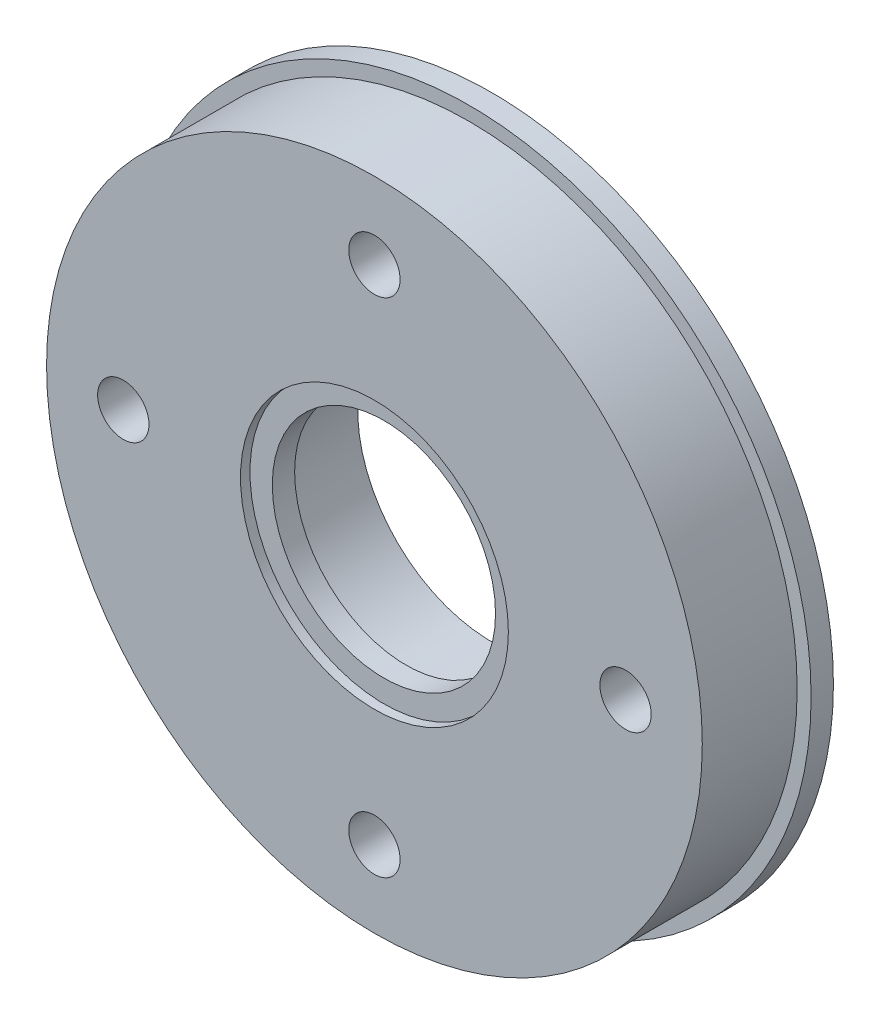
ISO-10303-21;
HEADER;
FILE_DESCRIPTION(('STEP AP214'),'2;1');
FILE_NAME('part.step','',(''),(''),'','','');
FILE_SCHEMA(('AUTOMOTIVE_DESIGN { 1 0 10303 214 1 1 1 1 }'));
ENDSEC;
DATA;
#1=APPLICATION_CONTEXT('core data for automotive mechanical design processes');
#2=APPLICATION_PROTOCOL_DEFINITION('international standard','automotive_design',2000,#1);
#3=PRODUCT_CONTEXT('',#1,'mechanical');
#4=PRODUCT('Part','Part','',(#3));
#5=PRODUCT_RELATED_PRODUCT_CATEGORY('part','',(#4));
#6=PRODUCT_DEFINITION_FORMATION('','',#4);
#7=PRODUCT_DEFINITION_CONTEXT('part definition',#1,'design');
#8=PRODUCT_DEFINITION('design','',#6,#7);
#9=PRODUCT_DEFINITION_SHAPE('','',#8);
#10=(LENGTH_UNIT() NAMED_UNIT(*) SI_UNIT(.MILLI.,.METRE.));
#11=(NAMED_UNIT(*) PLANE_ANGLE_UNIT() SI_UNIT($,.RADIAN.));
#12=(NAMED_UNIT(*) SI_UNIT($,.STERADIAN.) SOLID_ANGLE_UNIT());
#13=UNCERTAINTY_MEASURE_WITH_UNIT(LENGTH_MEASURE(1.E-05),#10,'distance_accuracy_value','');
#14=(GEOMETRIC_REPRESENTATION_CONTEXT(3) GLOBAL_UNCERTAINTY_ASSIGNED_CONTEXT((#13)) GLOBAL_UNIT_ASSIGNED_CONTEXT((#10,
#11,#12)) REPRESENTATION_CONTEXT('',''));
#15=CARTESIAN_POINT('',(0.,0.,0.));
#16=DIRECTION('',(0.,0.,1.));
#17=DIRECTION('',(1.,0.,0.));
#18=AXIS2_PLACEMENT_3D('',#15,#16,#17);
#19=CARTESIAN_POINT('',(0.,0.,2.));
#20=DIRECTION('',(0.,0.,-1.));
#21=DIRECTION('',(-1.,0.,0.));
#22=AXIS2_PLACEMENT_3D('',#19,#20,#21);
#23=CYLINDRICAL_SURFACE('',#22,12.);
#24=CARTESIAN_POINT('',(0.,0.,0.));
#25=DIRECTION('',(0.,0.,1.));
#26=DIRECTION('',(1.,0.,0.));
#27=AXIS2_PLACEMENT_3D('',#24,#25,#26);
#28=CIRCLE('',#27,12.);
#29=CARTESIAN_POINT('',(12.,0.,0.));
#30=VERTEX_POINT('',#29);
#31=EDGE_CURVE('E59',#30,#30,#28,.T.);
#32=ORIENTED_EDGE('',*,*,#31,.F.);
#33=EDGE_LOOP('',(#32));
#34=FACE_BOUND('',#33,.T.);
#35=CARTESIAN_POINT('',(0.,0.,7.65));
#36=DIRECTION('',(0.,0.,1.));
#37=DIRECTION('',(1.,0.,0.));
#38=AXIS2_PLACEMENT_3D('',#35,#36,#37);
#39=CIRCLE('',#38,12.);
#40=CARTESIAN_POINT('',(12.,0.,7.65));
#41=VERTEX_POINT('',#40);
#42=EDGE_CURVE('E77',#41,#41,#39,.T.);
#43=ORIENTED_EDGE('',*,*,#42,.T.);
#44=EDGE_LOOP('',(#43));
#45=FACE_BOUND('',#44,.T.);
#46=ADVANCED_FACE('F43',(#34,#45),#23,.F.);
#47=CARTESIAN_POINT('',(0.,0.,2.));
#48=DIRECTION('',(0.,0.,-1.));
#49=DIRECTION('',(-1.,0.,0.));
#50=AXIS2_PLACEMENT_3D('',#47,#48,#49);
#51=CYLINDRICAL_SURFACE('',#50,30.625);
#52=CARTESIAN_POINT('',(0.,0.,2.));
#53=DIRECTION('',(0.,0.,1.));
#54=DIRECTION('',(1.,0.,0.));
#55=AXIS2_PLACEMENT_3D('',#52,#53,#54);
#56=CIRCLE('',#55,30.625);
#57=CARTESIAN_POINT('',(30.625,0.,2.));
#58=VERTEX_POINT('',#57);
#59=EDGE_CURVE('E54',#58,#58,#56,.T.);
#60=ORIENTED_EDGE('',*,*,#59,.F.);
#61=EDGE_LOOP('',(#60));
#62=FACE_BOUND('',#61,.T.);
#63=CARTESIAN_POINT('',(0.,0.,0.));
#64=DIRECTION('',(0.,0.,1.));
#65=DIRECTION('',(1.,0.,0.));
#66=AXIS2_PLACEMENT_3D('',#63,#64,#65);
#67=CIRCLE('',#66,30.625);
#68=CARTESIAN_POINT('',(30.625,0.,0.));
#69=VERTEX_POINT('',#68);
#70=EDGE_CURVE('E65',#69,#69,#67,.T.);
#71=ORIENTED_EDGE('',*,*,#70,.T.);
#72=EDGE_LOOP('',(#71));
#73=FACE_BOUND('',#72,.T.);
#74=ADVANCED_FACE('F45',(#62,#73),#51,.T.);
#75=CARTESIAN_POINT('',(0.,0.,9.65));
#76=DIRECTION('',(0.,0.,1.));
#77=DIRECTION('',(1.,0.,0.));
#78=AXIS2_PLACEMENT_3D('',#75,#76,#77);
#79=CIRCLE('',#78,12.);
#80=CARTESIAN_POINT('',(12.,0.,9.65));
#81=VERTEX_POINT('',#80);
#82=EDGE_CURVE('E11',#81,#81,#79,.T.);
#83=ORIENTED_EDGE('',*,*,#82,.F.);
#84=EDGE_LOOP('',(#83));
#85=FACE_BOUND('',#84,.T.);
#86=CARTESIAN_POINT('',(0.,0.,10.5));
#87=DIRECTION('',(0.,0.,1.));
#88=DIRECTION('',(1.,0.,0.));
#89=AXIS2_PLACEMENT_3D('',#86,#87,#88);
#90=CIRCLE('',#89,12.);
#91=CARTESIAN_POINT('',(12.,0.,10.5));
#92=VERTEX_POINT('',#91);
#93=EDGE_CURVE('E83',#92,#92,#90,.T.);
#94=ORIENTED_EDGE('',*,*,#93,.T.);
#95=EDGE_LOOP('',(#94));
#96=FACE_BOUND('',#95,.T.);
#97=ADVANCED_FACE('F74',(#85,#96),#23,.F.);
#98=CARTESIAN_POINT('',(0.,0.,2.));
#99=DIRECTION('',(0.,0.,1.));
#100=DIRECTION('',(1.,0.,0.));
#101=AXIS2_PLACEMENT_3D('',#98,#99,#100);
#102=PLANE('',#101);
#103=CARTESIAN_POINT('',(0.,0.,2.));
#104=DIRECTION('',(0.,0.,1.));
#105=DIRECTION('',(1.,0.,0.));
#106=AXIS2_PLACEMENT_3D('',#103,#104,#105);
#107=CIRCLE('',#106,29.375);
#108=CARTESIAN_POINT('',(29.375,0.,2.));
#109=VERTEX_POINT('',#108);
#110=EDGE_CURVE('E50',#109,#109,#107,.T.);
#111=ORIENTED_EDGE('',*,*,#110,.F.);
#112=EDGE_LOOP('',(#111));
#113=FACE_BOUND('',#112,.T.);
#114=ORIENTED_EDGE('',*,*,#59,.T.);
#115=EDGE_LOOP('',(#114));
#116=FACE_BOUND('',#115,.T.);
#117=ADVANCED_FACE('F111',(#113,#116),#102,.T.);
#118=CARTESIAN_POINT('',(0.,0.,0.));
#119=DIRECTION('',(0.,0.,1.));
#120=DIRECTION('',(1.,0.,0.));
#121=AXIS2_PLACEMENT_3D('',#118,#119,#120);
#122=PLANE('',#121);
#123=ORIENTED_EDGE('',*,*,#70,.F.);
#124=EDGE_LOOP('',(#123));
#125=FACE_BOUND('',#124,.T.);
#126=ORIENTED_EDGE('',*,*,#31,.T.);
#127=EDGE_LOOP('',(#126));
#128=FACE_BOUND('',#127,.T.);
#129=ADVANCED_FACE('F70',(#125,#128),#122,.F.);
#130=CARTESIAN_POINT('',(0.,0.,10.5));
#131=DIRECTION('',(0.,0.,1.));
#132=DIRECTION('',(1.,0.,0.));
#133=AXIS2_PLACEMENT_3D('',#130,#131,#132);
#134=PLANE('',#133);
#135=CARTESIAN_POINT('',(0.,22.5,10.5));
#136=DIRECTION('',(0.,0.,1.));
#137=DIRECTION('',(1.,0.,0.));
#138=AXIS2_PLACEMENT_3D('',#135,#136,#137);
#139=CIRCLE('',#138,2.3);
#140=CARTESIAN_POINT('',(2.3,22.5,10.5));
#141=VERTEX_POINT('',#140);
#142=EDGE_CURVE('E262',#141,#141,#139,.T.);
#143=ORIENTED_EDGE('',*,*,#142,.F.);
#144=EDGE_LOOP('',(#143));
#145=FACE_BOUND('',#144,.T.);
#146=CARTESIAN_POINT('',(22.5,0.,10.5));
#147=DIRECTION('',(0.,0.,1.));
#148=DIRECTION('',(1.,0.,0.));
#149=AXIS2_PLACEMENT_3D('',#146,#147,#148);
#150=CIRCLE('',#149,2.3);
#151=CARTESIAN_POINT('',(24.8,0.,10.5));
#152=VERTEX_POINT('',#151);
#153=EDGE_CURVE('E270',#152,#152,#150,.T.);
#154=ORIENTED_EDGE('',*,*,#153,.F.);
#155=EDGE_LOOP('',(#154));
#156=FACE_BOUND('',#155,.T.);
#157=CARTESIAN_POINT('',(0.,-22.5,10.5));
#158=DIRECTION('',(0.,0.,1.));
#159=DIRECTION('',(1.,0.,0.));
#160=AXIS2_PLACEMENT_3D('',#157,#158,#159);
#161=CIRCLE('',#160,2.3);
#162=CARTESIAN_POINT('',(2.3,-22.5,10.5));
#163=VERTEX_POINT('',#162);
#164=EDGE_CURVE('E277',#163,#163,#161,.T.);
#165=ORIENTED_EDGE('',*,*,#164,.F.);
#166=EDGE_LOOP('',(#165));
#167=FACE_BOUND('',#166,.T.);
#168=CARTESIAN_POINT('',(-22.5,0.,10.5));
#169=DIRECTION('',(0.,0.,1.));
#170=DIRECTION('',(1.,0.,0.));
#171=AXIS2_PLACEMENT_3D('',#168,#169,#170);
#172=CIRCLE('',#171,2.3);
#173=CARTESIAN_POINT('',(-20.2,0.,10.5));
#174=VERTEX_POINT('',#173);
#175=EDGE_CURVE('E284',#174,#174,#172,.T.);
#176=ORIENTED_EDGE('',*,*,#175,.F.);
#177=EDGE_LOOP('',(#176));
#178=FACE_BOUND('',#177,.T.);
#179=CARTESIAN_POINT('',(0.,0.,10.5));
#180=DIRECTION('',(0.,0.,1.));
#181=DIRECTION('',(1.,0.,0.));
#182=AXIS2_PLACEMENT_3D('',#179,#180,#181);
#183=CIRCLE('',#182,29.375);
#184=CARTESIAN_POINT('',(29.375,0.,10.5));
#185=VERTEX_POINT('',#184);
#186=EDGE_CURVE('E62',#185,#185,#183,.T.);
#187=ORIENTED_EDGE('',*,*,#186,.T.);
#188=EDGE_LOOP('',(#187));
#189=FACE_BOUND('',#188,.T.);
#190=ORIENTED_EDGE('',*,*,#93,.F.);
#191=EDGE_LOOP('',(#190));
#192=FACE_BOUND('',#191,.T.);
#193=ADVANCED_FACE('F94',(#145,#156,#167,#178,#189,#192),#134,.T.);
#194=CARTESIAN_POINT('',(0.,0.,10.5));
#195=DIRECTION('',(0.,0.,-1.));
#196=DIRECTION('',(-1.,0.,0.));
#197=AXIS2_PLACEMENT_3D('',#194,#195,#196);
#198=CYLINDRICAL_SURFACE('',#197,29.375);
#199=ORIENTED_EDGE('',*,*,#186,.F.);
#200=EDGE_LOOP('',(#199));
#201=FACE_BOUND('',#200,.T.);
#202=ORIENTED_EDGE('',*,*,#110,.T.);
#203=EDGE_LOOP('',(#202));
#204=FACE_BOUND('',#203,.T.);
#205=ADVANCED_FACE('F97',(#201,#204),#198,.T.);
#206=CARTESIAN_POINT('',(0.,0.,9.65));
#207=DIRECTION('',(0.,0.,-1.));
#208=DIRECTION('',(-1.,0.,0.));
#209=AXIS2_PLACEMENT_3D('',#206,#207,#208);
#210=CYLINDRICAL_SURFACE('',#209,10.);
#211=CARTESIAN_POINT('',(0.,0.,9.65));
#212=DIRECTION('',(0.,0.,1.));
#213=DIRECTION('',(1.,0.,0.));
#214=AXIS2_PLACEMENT_3D('',#211,#212,#213);
#215=CIRCLE('',#214,10.);
#216=CARTESIAN_POINT('',(10.,0.,9.65));
#217=VERTEX_POINT('',#216);
#218=EDGE_CURVE('E79',#217,#217,#215,.T.);
#219=ORIENTED_EDGE('',*,*,#218,.T.);
#220=EDGE_LOOP('',(#219));
#221=FACE_BOUND('',#220,.T.);
#222=CARTESIAN_POINT('',(0.,0.,7.65));
#223=DIRECTION('',(0.,0.,1.));
#224=DIRECTION('',(1.,0.,0.));
#225=AXIS2_PLACEMENT_3D('',#222,#223,#224);
#226=CIRCLE('',#225,10.);
#227=CARTESIAN_POINT('',(10.,0.,7.65));
#228=VERTEX_POINT('',#227);
#229=EDGE_CURVE('E80',#228,#228,#226,.T.);
#230=ORIENTED_EDGE('',*,*,#229,.F.);
#231=EDGE_LOOP('',(#230));
#232=FACE_BOUND('',#231,.T.);
#233=ADVANCED_FACE('F99',(#221,#232),#210,.F.);
#234=CARTESIAN_POINT('',(0.,0.,9.65));
#235=DIRECTION('',(0.,0.,1.));
#236=DIRECTION('',(1.,0.,0.));
#237=AXIS2_PLACEMENT_3D('',#234,#235,#236);
#238=PLANE('',#237);
#239=ORIENTED_EDGE('',*,*,#218,.F.);
#240=EDGE_LOOP('',(#239));
#241=FACE_BOUND('',#240,.T.);
#242=ORIENTED_EDGE('',*,*,#82,.T.);
#243=EDGE_LOOP('',(#242));
#244=FACE_BOUND('',#243,.T.);
#245=ADVANCED_FACE('F105',(#241,#244),#238,.T.);
#246=CARTESIAN_POINT('',(0.,0.,7.65));
#247=DIRECTION('',(0.,0.,1.));
#248=DIRECTION('',(1.,0.,0.));
#249=AXIS2_PLACEMENT_3D('',#246,#247,#248);
#250=PLANE('',#249);
#251=ORIENTED_EDGE('',*,*,#229,.T.);
#252=EDGE_LOOP('',(#251));
#253=FACE_BOUND('',#252,.T.);
#254=ORIENTED_EDGE('',*,*,#42,.F.);
#255=EDGE_LOOP('',(#254));
#256=FACE_BOUND('',#255,.T.);
#257=ADVANCED_FACE('F160',(#253,#256),#250,.F.);
#258=CARTESIAN_POINT('',(-22.5,0.,1.5));
#259=DIRECTION('',(0.,0.,1.));
#260=DIRECTION('',(1.,0.,0.));
#261=AXIS2_PLACEMENT_3D('',#258,#259,#260);
#262=CYLINDRICAL_SURFACE('',#261,2.3);
#263=CARTESIAN_POINT('',(-22.5,0.,1.5));
#264=DIRECTION('',(0.,0.,1.));
#265=DIRECTION('',(1.,0.,0.));
#266=AXIS2_PLACEMENT_3D('',#263,#264,#265);
#267=CIRCLE('',#266,2.3);
#268=CARTESIAN_POINT('',(-20.2,0.,1.5));
#269=VERTEX_POINT('',#268);
#270=EDGE_CURVE('E281',#269,#269,#267,.T.);
#271=ORIENTED_EDGE('',*,*,#270,.F.);
#272=EDGE_LOOP('',(#271));
#273=FACE_BOUND('',#272,.T.);
#274=ORIENTED_EDGE('',*,*,#175,.T.);
#275=EDGE_LOOP('',(#274));
#276=FACE_BOUND('',#275,.T.);
#277=ADVANCED_FACE('F170',(#273,#276),#262,.F.);
#278=CARTESIAN_POINT('',(-22.5,0.,1.5));
#279=DIRECTION('',(0.,0.,1.));
#280=DIRECTION('',(1.,0.,0.));
#281=AXIS2_PLACEMENT_3D('',#278,#279,#280);
#282=PLANE('',#281);
#283=ORIENTED_EDGE('',*,*,#270,.T.);
#284=EDGE_LOOP('',(#283));
#285=FACE_BOUND('',#284,.T.);
#286=ADVANCED_FACE('F186',(#285),#282,.T.);
#287=CARTESIAN_POINT('',(0.,-22.5,1.5));
#288=DIRECTION('',(0.,0.,1.));
#289=DIRECTION('',(1.,0.,0.));
#290=AXIS2_PLACEMENT_3D('',#287,#288,#289);
#291=CYLINDRICAL_SURFACE('',#290,2.3);
#292=CARTESIAN_POINT('',(0.,-22.5,1.5));
#293=DIRECTION('',(0.,0.,1.));
#294=DIRECTION('',(1.,0.,0.));
#295=AXIS2_PLACEMENT_3D('',#292,#293,#294);
#296=CIRCLE('',#295,2.3);
#297=CARTESIAN_POINT('',(2.3,-22.5,1.5));
#298=VERTEX_POINT('',#297);
#299=EDGE_CURVE('E273',#298,#298,#296,.T.);
#300=ORIENTED_EDGE('',*,*,#299,.F.);
#301=EDGE_LOOP('',(#300));
#302=FACE_BOUND('',#301,.T.);
#303=ORIENTED_EDGE('',*,*,#164,.T.);
#304=EDGE_LOOP('',(#303));
#305=FACE_BOUND('',#304,.T.);
#306=ADVANCED_FACE('F196',(#302,#305),#291,.F.);
#307=CARTESIAN_POINT('',(0.,-22.5,1.5));
#308=DIRECTION('',(0.,0.,1.));
#309=DIRECTION('',(1.,0.,0.));
#310=AXIS2_PLACEMENT_3D('',#307,#308,#309);
#311=PLANE('',#310);
#312=ORIENTED_EDGE('',*,*,#299,.T.);
#313=EDGE_LOOP('',(#312));
#314=FACE_BOUND('',#313,.T.);
#315=ADVANCED_FACE('F206',(#314),#311,.T.);
#316=CARTESIAN_POINT('',(22.5,0.,1.5));
#317=DIRECTION('',(0.,0.,1.));
#318=DIRECTION('',(1.,0.,0.));
#319=AXIS2_PLACEMENT_3D('',#316,#317,#318);
#320=CYLINDRICAL_SURFACE('',#319,2.3);
#321=CARTESIAN_POINT('',(22.5,0.,1.5));
#322=DIRECTION('',(0.,0.,1.));
#323=DIRECTION('',(1.,0.,0.));
#324=AXIS2_PLACEMENT_3D('',#321,#322,#323);
#325=CIRCLE('',#324,2.3);
#326=CARTESIAN_POINT('',(24.8,0.,1.5));
#327=VERTEX_POINT('',#326);
#328=EDGE_CURVE('E265',#327,#327,#325,.T.);
#329=ORIENTED_EDGE('',*,*,#328,.F.);
#330=EDGE_LOOP('',(#329));
#331=FACE_BOUND('',#330,.T.);
#332=ORIENTED_EDGE('',*,*,#153,.T.);
#333=EDGE_LOOP('',(#332));
#334=FACE_BOUND('',#333,.T.);
#335=ADVANCED_FACE('F216',(#331,#334),#320,.F.);
#336=CARTESIAN_POINT('',(22.5,0.,1.5));
#337=DIRECTION('',(0.,0.,1.));
#338=DIRECTION('',(1.,0.,0.));
#339=AXIS2_PLACEMENT_3D('',#336,#337,#338);
#340=PLANE('',#339);
#341=ORIENTED_EDGE('',*,*,#328,.T.);
#342=EDGE_LOOP('',(#341));
#343=FACE_BOUND('',#342,.T.);
#344=ADVANCED_FACE('F226',(#343),#340,.T.);
#345=CARTESIAN_POINT('',(0.,22.5,1.5));
#346=DIRECTION('',(0.,0.,1.));
#347=DIRECTION('',(1.,0.,0.));
#348=AXIS2_PLACEMENT_3D('',#345,#346,#347);
#349=CYLINDRICAL_SURFACE('',#348,2.3);
#350=CARTESIAN_POINT('',(0.,22.5,1.5));
#351=DIRECTION('',(0.,0.,1.));
#352=DIRECTION('',(1.,0.,0.));
#353=AXIS2_PLACEMENT_3D('',#350,#351,#352);
#354=CIRCLE('',#353,2.3);
#355=CARTESIAN_POINT('',(2.3,22.5,1.5));
#356=VERTEX_POINT('',#355);
#357=EDGE_CURVE('E86',#356,#356,#354,.T.);
#358=ORIENTED_EDGE('',*,*,#357,.F.);
#359=EDGE_LOOP('',(#358));
#360=FACE_BOUND('',#359,.T.);
#361=ORIENTED_EDGE('',*,*,#142,.T.);
#362=EDGE_LOOP('',(#361));
#363=FACE_BOUND('',#362,.T.);
#364=ADVANCED_FACE('F236',(#360,#363),#349,.F.);
#365=CARTESIAN_POINT('',(0.,22.5,1.5));
#366=DIRECTION('',(0.,0.,1.));
#367=DIRECTION('',(1.,0.,0.));
#368=AXIS2_PLACEMENT_3D('',#365,#366,#367);
#369=PLANE('',#368);
#370=ORIENTED_EDGE('',*,*,#357,.T.);
#371=EDGE_LOOP('',(#370));
#372=FACE_BOUND('',#371,.T.);
#373=ADVANCED_FACE('F246',(#372),#369,.T.);
#374=CLOSED_SHELL('',(#46,#74,#97,#117,#129,#193,#205,#233,#245,#257,#277,#286,#306,#315,#335,
#344,#364,#373));
#375=MANIFOLD_SOLID_BREP('B2',#374);
#376=ADVANCED_BREP_SHAPE_REPRESENTATION('',(#18,#375),#14);
#377=SHAPE_DEFINITION_REPRESENTATION(#9,#376);
ENDSEC;
END-ISO-10303-21;
